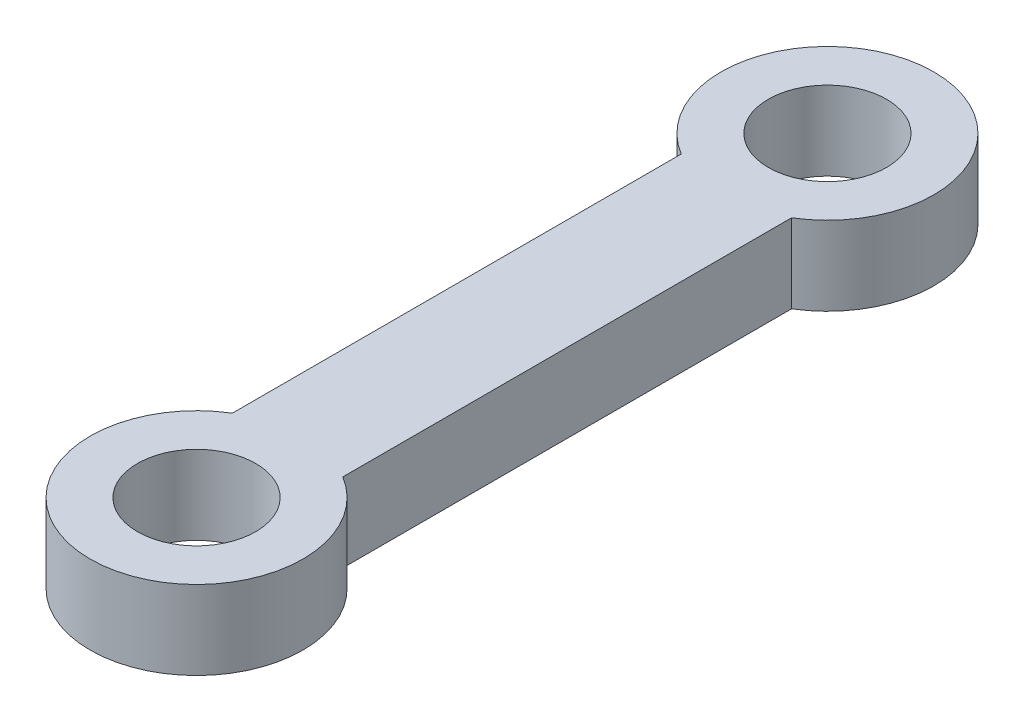
ISO-10303-21;
HEADER;
FILE_DESCRIPTION(('STEP AP214'),'2;1');
FILE_NAME('part.step','',(''),(''),'','','');
FILE_SCHEMA(('AUTOMOTIVE_DESIGN { 1 0 10303 214 1 1 1 1 }'));
ENDSEC;
DATA;
#1=APPLICATION_CONTEXT('core data for automotive mechanical design processes');
#2=APPLICATION_PROTOCOL_DEFINITION('international standard','automotive_design',2000,#1);
#3=PRODUCT_CONTEXT('',#1,'mechanical');
#4=PRODUCT('Part','Part','',(#3));
#5=PRODUCT_RELATED_PRODUCT_CATEGORY('part','',(#4));
#6=PRODUCT_DEFINITION_FORMATION('','',#4);
#7=PRODUCT_DEFINITION_CONTEXT('part definition',#1,'design');
#8=PRODUCT_DEFINITION('design','',#6,#7);
#9=PRODUCT_DEFINITION_SHAPE('','',#8);
#10=(LENGTH_UNIT() NAMED_UNIT(*) SI_UNIT(.MILLI.,.METRE.));
#11=(NAMED_UNIT(*) PLANE_ANGLE_UNIT() SI_UNIT($,.RADIAN.));
#12=(NAMED_UNIT(*) SI_UNIT($,.STERADIAN.) SOLID_ANGLE_UNIT());
#13=UNCERTAINTY_MEASURE_WITH_UNIT(LENGTH_MEASURE(1.E-05),#10,'distance_accuracy_value','');
#14=(GEOMETRIC_REPRESENTATION_CONTEXT(3) GLOBAL_UNCERTAINTY_ASSIGNED_CONTEXT((#13)) GLOBAL_UNIT_ASSIGNED_CONTEXT((#10,
#11,#12)) REPRESENTATION_CONTEXT('',''));
#15=CARTESIAN_POINT('',(0.,0.,0.));
#16=DIRECTION('',(0.,0.,1.));
#17=DIRECTION('',(1.,0.,0.));
#18=AXIS2_PLACEMENT_3D('',#15,#16,#17);
#19=CARTESIAN_POINT('',(0.,2.,0.));
#20=DIRECTION('',(0.,1.,0.));
#21=DIRECTION('',(0.,0.,1.00000000000001));
#22=AXIS2_PLACEMENT_3D('',#19,#20,#21);
#23=PLANE('',#22);
#24=CARTESIAN_POINT('',(0.,2.,0.));
#25=DIRECTION('',(0.,1.,0.));
#26=DIRECTION('',(0.,0.,1.00000000000001));
#27=AXIS2_PLACEMENT_3D('',#24,#25,#26);
#28=CIRCLE('',#27,1.5);
#29=CARTESIAN_POINT('',(0.,2.,1.5));
#30=VERTEX_POINT('',#29);
#31=EDGE_CURVE('E102',#30,#30,#28,.T.);
#32=ORIENTED_EDGE('',*,*,#31,.F.);
#33=EDGE_LOOP('',(#32));
#34=FACE_BOUND('',#33,.T.);
#35=CARTESIAN_POINT('',(0.,2.,0.));
#36=DIRECTION('',(0.,1.,0.));
#37=DIRECTION('',(0.,0.,1.00000000000001));
#38=AXIS2_PLACEMENT_3D('',#35,#36,#37);
#39=CIRCLE('',#38,2.7);
#40=CARTESIAN_POINT('',(1.39999999999987,2.0000000000001,2.30867927612303));
#41=VERTEX_POINT('',#40);
#42=CARTESIAN_POINT('',(-1.40000000000007,2.,2.30867927612297));
#43=VERTEX_POINT('',#42);
#44=EDGE_CURVE('E90',#41,#43,#39,.T.);
#45=ORIENTED_EDGE('',*,*,#44,.T.);
#46=DIRECTION('',(0.,0.,1.00000000000001));
#47=VECTOR('',#46,1.);
#48=CARTESIAN_POINT('',(-1.40000000000007,2.,2.30867927612297));
#49=LINE('',#48,#47);
#50=CARTESIAN_POINT('',(-1.40000000000023,2.,13.6913207238769));
#51=VERTEX_POINT('',#50);
#52=EDGE_CURVE('E85',#43,#51,#49,.T.);
#53=ORIENTED_EDGE('',*,*,#52,.T.);
#54=CARTESIAN_POINT('',(-3.33066907387547E-13,2.,15.9999999999999));
#55=DIRECTION('',(0.,1.,0.));
#56=DIRECTION('',(0.,0.,1.00000000000001));
#57=AXIS2_PLACEMENT_3D('',#54,#55,#56);
#58=CIRCLE('',#57,2.7);
#59=CARTESIAN_POINT('',(1.39999999999998,2.00000000000007,13.691320723877));
#60=VERTEX_POINT('',#59);
#61=EDGE_CURVE('E87',#51,#60,#58,.T.);
#62=ORIENTED_EDGE('',*,*,#61,.T.);
#63=DIRECTION('',(0.,0.,-1.00000000000001));
#64=VECTOR('',#63,1.);
#65=CARTESIAN_POINT('',(1.39999999999987,2.0000000000001,2.30867927612303));
#66=LINE('',#65,#64);
#67=EDGE_CURVE('E53',#60,#41,#66,.T.);
#68=ORIENTED_EDGE('',*,*,#67,.T.);
#69=EDGE_LOOP('',(#45,#53,#62,#68));
#70=FACE_BOUND('',#69,.T.);
#71=CARTESIAN_POINT('',(-3.33066907387547E-13,2.,15.9999999999999));
#72=DIRECTION('',(0.,1.,0.));
#73=DIRECTION('',(0.,0.,1.00000000000001));
#74=AXIS2_PLACEMENT_3D('',#71,#72,#73);
#75=CIRCLE('',#74,1.5);
#76=CARTESIAN_POINT('',(-3.33066907387547E-13,2.,17.4999999999999));
#77=VERTEX_POINT('',#76);
#78=EDGE_CURVE('E118',#77,#77,#75,.T.);
#79=ORIENTED_EDGE('',*,*,#78,.F.);
#80=EDGE_LOOP('',(#79));
#81=FACE_BOUND('',#80,.T.);
#82=ADVANCED_FACE('F40',(#34,#70,#81),#23,.T.);
#83=CARTESIAN_POINT('',(0.,0.,0.));
#84=DIRECTION('',(0.,1.,0.));
#85=DIRECTION('',(0.,0.,1.00000000000001));
#86=AXIS2_PLACEMENT_3D('',#83,#84,#85);
#87=PLANE('',#86);
#88=CARTESIAN_POINT('',(0.,0.,0.));
#89=DIRECTION('',(0.,1.,0.));
#90=DIRECTION('',(0.,0.,1.00000000000001));
#91=AXIS2_PLACEMENT_3D('',#88,#89,#90);
#92=CIRCLE('',#91,2.7);
#93=CARTESIAN_POINT('',(1.3999999999999,0.,2.30867927612308));
#94=VERTEX_POINT('',#93);
#95=CARTESIAN_POINT('',(-1.40000000000001,0.,2.30867927612304));
#96=VERTEX_POINT('',#95);
#97=EDGE_CURVE('E101',#94,#96,#92,.T.);
#98=ORIENTED_EDGE('',*,*,#97,.F.);
#99=DIRECTION('',(0.,0.,-1.00000000000001));
#100=VECTOR('',#99,1.);
#101=CARTESIAN_POINT('',(1.3999999999999,0.,2.30867927612308));
#102=LINE('',#101,#100);
#103=CARTESIAN_POINT('',(1.39999999999987,0.,13.6913207238771));
#104=VERTEX_POINT('',#103);
#105=EDGE_CURVE('E79',#104,#94,#102,.T.);
#106=ORIENTED_EDGE('',*,*,#105,.F.);
#107=CARTESIAN_POINT('',(-2.77555756156289E-13,0.,16.));
#108=DIRECTION('',(0.,1.,0.));
#109=DIRECTION('',(0.,0.,1.00000000000001));
#110=AXIS2_PLACEMENT_3D('',#107,#108,#109);
#111=CIRCLE('',#110,2.7);
#112=CARTESIAN_POINT('',(-1.40000000000001,0.,13.691320723877));
#113=VERTEX_POINT('',#112);
#114=EDGE_CURVE('E72',#113,#104,#111,.T.);
#115=ORIENTED_EDGE('',*,*,#114,.F.);
#116=DIRECTION('',(0.,0.,1.00000000000001));
#117=VECTOR('',#116,1.);
#118=CARTESIAN_POINT('',(-1.40000000000001,0.,2.30867927612304));
#119=LINE('',#118,#117);
#120=EDGE_CURVE('E91',#96,#113,#119,.T.);
#121=ORIENTED_EDGE('',*,*,#120,.F.);
#122=EDGE_LOOP('',(#98,#106,#115,#121));
#123=FACE_BOUND('',#122,.T.);
#124=CARTESIAN_POINT('',(0.,0.,0.));
#125=DIRECTION('',(0.,1.,0.));
#126=DIRECTION('',(0.,0.,1.00000000000001));
#127=AXIS2_PLACEMENT_3D('',#124,#125,#126);
#128=CIRCLE('',#127,1.5);
#129=CARTESIAN_POINT('',(0.,0.,1.50000000000001));
#130=VERTEX_POINT('',#129);
#131=EDGE_CURVE('E116',#130,#130,#128,.T.);
#132=ORIENTED_EDGE('',*,*,#131,.T.);
#133=EDGE_LOOP('',(#132));
#134=FACE_BOUND('',#133,.T.);
#135=CARTESIAN_POINT('',(-2.77555756156289E-13,0.,16.));
#136=DIRECTION('',(0.,1.,0.));
#137=DIRECTION('',(0.,0.,1.00000000000001));
#138=AXIS2_PLACEMENT_3D('',#135,#136,#137);
#139=CIRCLE('',#138,1.5);
#140=CARTESIAN_POINT('',(-2.77555756156289E-13,0.,17.5));
#141=VERTEX_POINT('',#140);
#142=EDGE_CURVE('E124',#141,#141,#139,.T.);
#143=ORIENTED_EDGE('',*,*,#142,.T.);
#144=EDGE_LOOP('',(#143));
#145=FACE_BOUND('',#144,.T.);
#146=ADVANCED_FACE('F115',(#123,#134,#145),#87,.F.);
#147=CARTESIAN_POINT('',(0.,2.,0.));
#148=DIRECTION('',(0.,-1.,0.));
#149=DIRECTION('',(0.,0.,-1.00000000000001));
#150=AXIS2_PLACEMENT_3D('',#147,#148,#149);
#151=CYLINDRICAL_SURFACE('',#150,2.7);
#152=ORIENTED_EDGE('',*,*,#97,.T.);
#153=DIRECTION('',(0.,-1.,0.));
#154=VECTOR('',#153,1.);
#155=CARTESIAN_POINT('',(-1.40000000000007,2.,2.30867927612297));
#156=LINE('',#155,#154);
#157=EDGE_CURVE('E11',#43,#96,#156,.T.);
#158=ORIENTED_EDGE('',*,*,#157,.F.);
#159=ORIENTED_EDGE('',*,*,#44,.F.);
#160=DIRECTION('',(0.,-1.,0.));
#161=VECTOR('',#160,1.);
#162=CARTESIAN_POINT('',(1.39999999999987,2.0000000000001,2.30867927612303));
#163=LINE('',#162,#161);
#164=EDGE_CURVE('E100',#41,#94,#163,.T.);
#165=ORIENTED_EDGE('',*,*,#164,.T.);
#166=EDGE_LOOP('',(#152,#158,#159,#165));
#167=FACE_BOUND('',#166,.T.);
#168=ADVANCED_FACE('F39',(#167),#151,.T.);
#169=CARTESIAN_POINT('',(-1.40000000000007,2.,2.30867927612297));
#170=DIRECTION('',(1.00000000000001,0.,0.));
#171=DIRECTION('',(0.,0.,-1.00000000000001));
#172=AXIS2_PLACEMENT_3D('',#169,#170,#171);
#173=PLANE('',#172);
#174=ORIENTED_EDGE('',*,*,#120,.T.);
#175=DIRECTION('',(0.,-1.,0.));
#176=VECTOR('',#175,1.);
#177=CARTESIAN_POINT('',(-1.40000000000023,2.,13.6913207238769));
#178=LINE('',#177,#176);
#179=EDGE_CURVE('E46',#51,#113,#178,.T.);
#180=ORIENTED_EDGE('',*,*,#179,.F.);
#181=ORIENTED_EDGE('',*,*,#52,.F.);
#182=ORIENTED_EDGE('',*,*,#157,.T.);
#183=EDGE_LOOP('',(#174,#180,#181,#182));
#184=FACE_BOUND('',#183,.T.);
#185=ADVANCED_FACE('F95',(#184),#173,.F.);
#186=CARTESIAN_POINT('',(-3.33066907387547E-13,2.,15.9999999999999));
#187=DIRECTION('',(0.,-1.,0.));
#188=DIRECTION('',(0.,0.,-1.00000000000001));
#189=AXIS2_PLACEMENT_3D('',#186,#187,#188);
#190=CYLINDRICAL_SURFACE('',#189,2.7);
#191=ORIENTED_EDGE('',*,*,#114,.T.);
#192=DIRECTION('',(0.,-1.,0.));
#193=VECTOR('',#192,1.);
#194=CARTESIAN_POINT('',(1.39999999999998,2.00000000000007,13.691320723877));
#195=LINE('',#194,#193);
#196=EDGE_CURVE('E94',#60,#104,#195,.T.);
#197=ORIENTED_EDGE('',*,*,#196,.F.);
#198=ORIENTED_EDGE('',*,*,#61,.F.);
#199=ORIENTED_EDGE('',*,*,#179,.T.);
#200=EDGE_LOOP('',(#191,#197,#198,#199));
#201=FACE_BOUND('',#200,.T.);
#202=ADVANCED_FACE('F92',(#201),#190,.T.);
#203=CARTESIAN_POINT('',(1.39999999999987,2.0000000000001,2.30867927612303));
#204=DIRECTION('',(-1.00000000000001,0.,0.));
#205=DIRECTION('',(0.,0.,1.00000000000001));
#206=AXIS2_PLACEMENT_3D('',#203,#204,#205);
#207=PLANE('',#206);
#208=ORIENTED_EDGE('',*,*,#105,.T.);
#209=ORIENTED_EDGE('',*,*,#164,.F.);
#210=ORIENTED_EDGE('',*,*,#67,.F.);
#211=ORIENTED_EDGE('',*,*,#196,.T.);
#212=EDGE_LOOP('',(#208,#209,#210,#211));
#213=FACE_BOUND('',#212,.T.);
#214=ADVANCED_FACE('F108',(#213),#207,.F.);
#215=CARTESIAN_POINT('',(0.,2.,0.));
#216=DIRECTION('',(0.,-1.,0.));
#217=DIRECTION('',(0.,0.,-1.00000000000001));
#218=AXIS2_PLACEMENT_3D('',#215,#216,#217);
#219=CYLINDRICAL_SURFACE('',#218,1.5);
#220=ORIENTED_EDGE('',*,*,#31,.T.);
#221=EDGE_LOOP('',(#220));
#222=FACE_BOUND('',#221,.T.);
#223=ORIENTED_EDGE('',*,*,#131,.F.);
#224=EDGE_LOOP('',(#223));
#225=FACE_BOUND('',#224,.T.);
#226=ADVANCED_FACE('F140',(#222,#225),#219,.F.);
#227=CARTESIAN_POINT('',(-3.33066907387547E-13,2.,15.9999999999999));
#228=DIRECTION('',(0.,-1.,0.));
#229=DIRECTION('',(0.,0.,-1.00000000000001));
#230=AXIS2_PLACEMENT_3D('',#227,#228,#229);
#231=CYLINDRICAL_SURFACE('',#230,1.5);
#232=ORIENTED_EDGE('',*,*,#78,.T.);
#233=EDGE_LOOP('',(#232));
#234=FACE_BOUND('',#233,.T.);
#235=ORIENTED_EDGE('',*,*,#142,.F.);
#236=EDGE_LOOP('',(#235));
#237=FACE_BOUND('',#236,.T.);
#238=ADVANCED_FACE('F126',(#234,#237),#231,.F.);
#239=CLOSED_SHELL('',(#82,#146,#168,#185,#202,#214,#226,#238));
#240=MANIFOLD_SOLID_BREP('B2',#239);
#241=ADVANCED_BREP_SHAPE_REPRESENTATION('',(#18,#240),#14);
#242=SHAPE_DEFINITION_REPRESENTATION(#9,#241);
ENDSEC;
END-ISO-10303-21;
